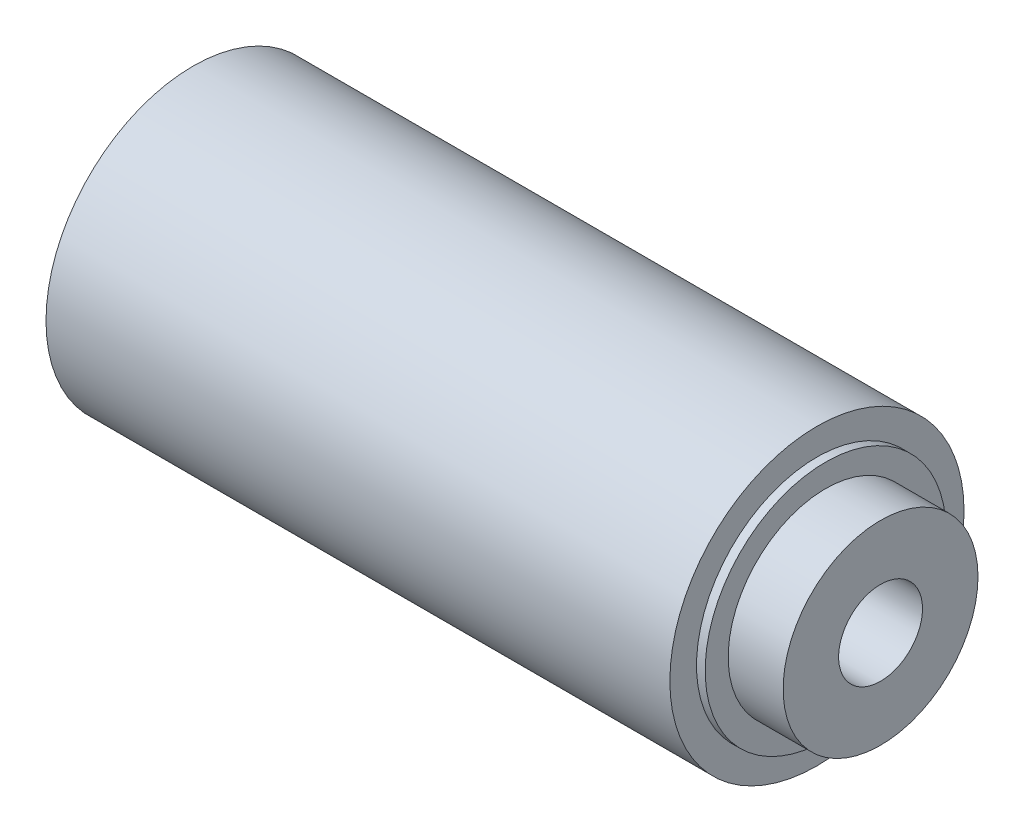
ISO-10303-21;
HEADER;
FILE_DESCRIPTION(('STEP AP214'),'2;1');
FILE_NAME('part.step','',(''),(''),'','','');
FILE_SCHEMA(('AUTOMOTIVE_DESIGN { 1 0 10303 214 1 1 1 1 }'));
ENDSEC;
DATA;
#1=APPLICATION_CONTEXT('core data for automotive mechanical design processes');
#2=APPLICATION_PROTOCOL_DEFINITION('international standard','automotive_design',2000,#1);
#3=PRODUCT_CONTEXT('',#1,'mechanical');
#4=PRODUCT('Part','Part','',(#3));
#5=PRODUCT_RELATED_PRODUCT_CATEGORY('part','',(#4));
#6=PRODUCT_DEFINITION_FORMATION('','',#4);
#7=PRODUCT_DEFINITION_CONTEXT('part definition',#1,'design');
#8=PRODUCT_DEFINITION('design','',#6,#7);
#9=PRODUCT_DEFINITION_SHAPE('','',#8);
#10=(LENGTH_UNIT() NAMED_UNIT(*) SI_UNIT(.MILLI.,.METRE.));
#11=(NAMED_UNIT(*) PLANE_ANGLE_UNIT() SI_UNIT($,.RADIAN.));
#12=(NAMED_UNIT(*) SI_UNIT($,.STERADIAN.) SOLID_ANGLE_UNIT());
#13=UNCERTAINTY_MEASURE_WITH_UNIT(LENGTH_MEASURE(1.E-05),#10,'distance_accuracy_value','');
#14=(GEOMETRIC_REPRESENTATION_CONTEXT(3) GLOBAL_UNCERTAINTY_ASSIGNED_CONTEXT((#13)) GLOBAL_UNIT_ASSIGNED_CONTEXT((#10,
#11,#12)) REPRESENTATION_CONTEXT('',''));
#15=CARTESIAN_POINT('',(0.,0.,0.));
#16=DIRECTION('',(0.,0.,1.));
#17=DIRECTION('',(1.,0.,0.));
#18=AXIS2_PLACEMENT_3D('',#15,#16,#17);
#19=CARTESIAN_POINT('',(230.5,0.,0.));
#20=DIRECTION('',(1.,0.,0.));
#21=DIRECTION('',(0.,0.,-1.));
#22=AXIS2_PLACEMENT_3D('',#19,#20,#21);
#23=CYLINDRICAL_SURFACE('',#22,44.5);
#24=CARTESIAN_POINT('',(230.5,0.,0.));
#25=DIRECTION('',(1.,0.,0.));
#26=DIRECTION('',(0.,0.,-1.));
#27=AXIS2_PLACEMENT_3D('',#24,#25,#26);
#28=CIRCLE('',#27,44.5);
#29=CARTESIAN_POINT('',(230.5,0.,-44.5));
#30=VERTEX_POINT('',#29);
#31=EDGE_CURVE('E403',#30,#30,#28,.T.);
#32=ORIENTED_EDGE('',*,*,#31,.T.);
#33=EDGE_LOOP('',(#32));
#34=FACE_BOUND('',#33,.T.);
#35=CARTESIAN_POINT('',(233.7,0.,0.));
#36=DIRECTION('',(1.,0.,0.));
#37=DIRECTION('',(0.,0.,-1.));
#38=AXIS2_PLACEMENT_3D('',#35,#36,#37);
#39=CIRCLE('',#38,44.5);
#40=CARTESIAN_POINT('',(233.7,0.,-44.5));
#41=VERTEX_POINT('',#40);
#42=EDGE_CURVE('E399',#41,#41,#39,.T.);
#43=ORIENTED_EDGE('',*,*,#42,.F.);
#44=EDGE_LOOP('',(#43));
#45=FACE_BOUND('',#44,.T.);
#46=ADVANCED_FACE('F38',(#34,#45),#23,.T.);
#47=CARTESIAN_POINT('',(230.5,0.,0.));
#48=DIRECTION('',(1.,0.,0.));
#49=DIRECTION('',(0.,0.,-1.));
#50=AXIS2_PLACEMENT_3D('',#47,#48,#49);
#51=PLANE('',#50);
#52=ORIENTED_EDGE('',*,*,#31,.F.);
#53=EDGE_LOOP('',(#52));
#54=FACE_BOUND('',#53,.T.);
#55=CARTESIAN_POINT('',(230.5,0.,0.));
#56=DIRECTION('',(1.,0.,0.));
#57=DIRECTION('',(0.,0.,-1.));
#58=AXIS2_PLACEMENT_3D('',#55,#56,#57);
#59=CIRCLE('',#58,54.345);
#60=CARTESIAN_POINT('',(230.5,0.,-54.345));
#61=VERTEX_POINT('',#60);
#62=EDGE_CURVE('E192',#61,#61,#59,.T.);
#63=ORIENTED_EDGE('',*,*,#62,.T.);
#64=EDGE_LOOP('',(#63));
#65=FACE_BOUND('',#64,.T.);
#66=ADVANCED_FACE('F232',(#54,#65),#51,.T.);
#67=CARTESIAN_POINT('',(100.,0.,0.));
#68=DIRECTION('',(1.,0.,0.));
#69=DIRECTION('',(0.,0.,-1.));
#70=AXIS2_PLACEMENT_3D('',#67,#68,#69);
#71=PLANE('',#70);
#72=CARTESIAN_POINT('',(100.,-28.194,28.1939999999984));
#73=DIRECTION('',(1.,0.,0.));
#74=DIRECTION('',(0.,0.,-1.));
#75=AXIS2_PLACEMENT_3D('',#72,#73,#74);
#76=CIRCLE('',#75,7.50000000000083);
#77=CARTESIAN_POINT('',(100.,-28.194,20.6939999999976));
#78=VERTEX_POINT('',#77);
#79=CARTESIAN_POINT('',(100.,-20.6939999999992,28.194));
#80=VERTEX_POINT('',#79);
#81=EDGE_CURVE('E157',#78,#80,#76,.T.);
#82=ORIENTED_EDGE('',*,*,#81,.T.);
#83=DIRECTION('',(0.,-1.,0.));
#84=VECTOR('',#83,1.);
#85=CARTESIAN_POINT('',(100.,0.,28.194));
#86=LINE('',#85,#84);
#87=CARTESIAN_POINT('',(100.,20.694,28.194));
#88=VERTEX_POINT('',#87);
#89=EDGE_CURVE('E62',#88,#80,#86,.T.);
#90=ORIENTED_EDGE('',*,*,#89,.F.);
#91=CARTESIAN_POINT('',(100.,28.194,28.194));
#92=DIRECTION('',(1.,0.,0.));
#93=DIRECTION('',(0.,0.,-1.));
#94=AXIS2_PLACEMENT_3D('',#91,#92,#93);
#95=CIRCLE('',#94,7.5);
#96=CARTESIAN_POINT('',(100.,28.194,20.694));
#97=VERTEX_POINT('',#96);
#98=EDGE_CURVE('E114',#88,#97,#95,.T.);
#99=ORIENTED_EDGE('',*,*,#98,.T.);
#100=DIRECTION('',(0.,0.,-1.));
#101=VECTOR('',#100,1.);
#102=CARTESIAN_POINT('',(100.,28.194,0.));
#103=LINE('',#102,#101);
#104=CARTESIAN_POINT('',(100.,28.194,-20.6939999999984));
#105=VERTEX_POINT('',#104);
#106=EDGE_CURVE('E123',#97,#105,#103,.T.);
#107=ORIENTED_EDGE('',*,*,#106,.T.);
#108=CARTESIAN_POINT('',(100.,28.1940000000016,-28.194));
#109=DIRECTION('',(1.,0.,0.));
#110=DIRECTION('',(0.,0.,-1.));
#111=AXIS2_PLACEMENT_3D('',#108,#109,#110);
#112=CIRCLE('',#111,7.50000000000164);
#113=CARTESIAN_POINT('',(100.,20.694,-28.194));
#114=VERTEX_POINT('',#113);
#115=EDGE_CURVE('E128',#105,#114,#112,.T.);
#116=ORIENTED_EDGE('',*,*,#115,.T.);
#117=DIRECTION('',(0.,-1.,0.));
#118=VECTOR('',#117,1.);
#119=CARTESIAN_POINT('',(100.,0.,-28.194));
#120=LINE('',#119,#118);
#121=CARTESIAN_POINT('',(100.,-20.6939999999962,-28.194));
#122=VERTEX_POINT('',#121);
#123=EDGE_CURVE('E202',#114,#122,#120,.T.);
#124=ORIENTED_EDGE('',*,*,#123,.T.);
#125=CARTESIAN_POINT('',(100.,-28.1939999999984,-28.1940000000016));
#126=DIRECTION('',(1.,0.,0.));
#127=DIRECTION('',(0.,0.,-1.));
#128=AXIS2_PLACEMENT_3D('',#125,#126,#127);
#129=CIRCLE('',#128,7.50000000000223);
#130=CARTESIAN_POINT('',(100.,-28.194,-20.6939999999994));
#131=VERTEX_POINT('',#130);
#132=EDGE_CURVE('E199',#122,#131,#129,.T.);
#133=ORIENTED_EDGE('',*,*,#132,.T.);
#134=DIRECTION('',(0.,0.,-1.));
#135=VECTOR('',#134,1.);
#136=CARTESIAN_POINT('',(100.,-28.194,0.));
#137=LINE('',#136,#135);
#138=EDGE_CURVE('E197',#78,#131,#137,.T.);
#139=ORIENTED_EDGE('',*,*,#138,.F.);
#140=EDGE_LOOP('',(#82,#90,#99,#107,#116,#124,#133,#139));
#141=FACE_BOUND('',#140,.T.);
#142=ADVANCED_FACE('F131',(#141),#71,.F.);
#143=CARTESIAN_POINT('',(100.,28.194,28.194));
#144=DIRECTION('',(-1.,0.,0.));
#145=DIRECTION('',(0.,0.,1.));
#146=AXIS2_PLACEMENT_3D('',#143,#144,#145);
#147=CYLINDRICAL_SURFACE('',#146,7.5);
#148=CARTESIAN_POINT('',(0.,28.194,28.194));
#149=DIRECTION('',(1.,0.,0.));
#150=DIRECTION('',(0.,0.,-1.));
#151=AXIS2_PLACEMENT_3D('',#148,#149,#150);
#152=CIRCLE('',#151,7.5);
#153=CARTESIAN_POINT('',(0.,20.694,28.194));
#154=VERTEX_POINT('',#153);
#155=CARTESIAN_POINT('',(0.,28.194,20.694));
#156=VERTEX_POINT('',#155);
#157=EDGE_CURVE('E116',#154,#156,#152,.T.);
#158=ORIENTED_EDGE('',*,*,#157,.T.);
#159=DIRECTION('',(-1.,0.,0.));
#160=VECTOR('',#159,1.);
#161=CARTESIAN_POINT('',(100.,28.194,20.694));
#162=LINE('',#161,#160);
#163=EDGE_CURVE('E110',#97,#156,#162,.T.);
#164=ORIENTED_EDGE('',*,*,#163,.F.);
#165=ORIENTED_EDGE('',*,*,#98,.F.);
#166=DIRECTION('',(-1.,0.,0.));
#167=VECTOR('',#166,1.);
#168=CARTESIAN_POINT('',(100.,20.694,28.194));
#169=LINE('',#168,#167);
#170=EDGE_CURVE('E89',#88,#154,#169,.T.);
#171=ORIENTED_EDGE('',*,*,#170,.T.);
#172=EDGE_LOOP('',(#158,#164,#165,#171));
#173=FACE_BOUND('',#172,.T.);
#174=ADVANCED_FACE('F112',(#173),#147,.T.);
#175=CARTESIAN_POINT('',(100.,28.194,0.));
#176=DIRECTION('',(0.,1.,0.));
#177=DIRECTION('',(0.,0.,1.));
#178=AXIS2_PLACEMENT_3D('',#175,#176,#177);
#179=PLANE('',#178);
#180=DIRECTION('',(0.,0.,-1.));
#181=VECTOR('',#180,1.);
#182=CARTESIAN_POINT('',(0.,28.194,0.));
#183=LINE('',#182,#181);
#184=CARTESIAN_POINT('',(0.,28.194,-20.6939999999984));
#185=VERTEX_POINT('',#184);
#186=EDGE_CURVE('E151',#156,#185,#183,.T.);
#187=ORIENTED_EDGE('',*,*,#186,.T.);
#188=DIRECTION('',(-1.,0.,0.));
#189=VECTOR('',#188,1.);
#190=CARTESIAN_POINT('',(100.,28.194,-20.6939999999984));
#191=LINE('',#190,#189);
#192=EDGE_CURVE('E120',#105,#185,#191,.T.);
#193=ORIENTED_EDGE('',*,*,#192,.F.);
#194=ORIENTED_EDGE('',*,*,#106,.F.);
#195=ORIENTED_EDGE('',*,*,#163,.T.);
#196=EDGE_LOOP('',(#187,#193,#194,#195));
#197=FACE_BOUND('',#196,.T.);
#198=ADVANCED_FACE('F124',(#197),#179,.F.);
#199=CARTESIAN_POINT('',(100.,28.1940000000016,-28.194));
#200=DIRECTION('',(-1.,0.,0.));
#201=DIRECTION('',(0.,0.,1.));
#202=AXIS2_PLACEMENT_3D('',#199,#200,#201);
#203=CYLINDRICAL_SURFACE('',#202,7.50000000000164);
#204=CARTESIAN_POINT('',(0.,28.1940000000016,-28.194));
#205=DIRECTION('',(1.,0.,0.));
#206=DIRECTION('',(0.,0.,-1.));
#207=AXIS2_PLACEMENT_3D('',#204,#205,#206);
#208=CIRCLE('',#207,7.50000000000164);
#209=CARTESIAN_POINT('',(0.,20.694,-28.194));
#210=VERTEX_POINT('',#209);
#211=EDGE_CURVE('E148',#185,#210,#208,.T.);
#212=ORIENTED_EDGE('',*,*,#211,.T.);
#213=DIRECTION('',(-1.,0.,0.));
#214=VECTOR('',#213,1.);
#215=CARTESIAN_POINT('',(100.,20.694,-28.194));
#216=LINE('',#215,#214);
#217=EDGE_CURVE('E161',#114,#210,#216,.T.);
#218=ORIENTED_EDGE('',*,*,#217,.F.);
#219=ORIENTED_EDGE('',*,*,#115,.F.);
#220=ORIENTED_EDGE('',*,*,#192,.T.);
#221=EDGE_LOOP('',(#212,#218,#219,#220));
#222=FACE_BOUND('',#221,.T.);
#223=ADVANCED_FACE('F206',(#222),#203,.T.);
#224=CARTESIAN_POINT('',(100.,0.,-28.194));
#225=DIRECTION('',(0.,0.,-1.));
#226=DIRECTION('',(0.,1.,0.));
#227=AXIS2_PLACEMENT_3D('',#224,#225,#226);
#228=PLANE('',#227);
#229=DIRECTION('',(0.,-1.,0.));
#230=VECTOR('',#229,1.);
#231=CARTESIAN_POINT('',(0.,0.,-28.194));
#232=LINE('',#231,#230);
#233=CARTESIAN_POINT('',(0.,-20.6939999999962,-28.194));
#234=VERTEX_POINT('',#233);
#235=EDGE_CURVE('E145',#210,#234,#232,.T.);
#236=ORIENTED_EDGE('',*,*,#235,.T.);
#237=DIRECTION('',(-1.,0.,0.));
#238=VECTOR('',#237,1.);
#239=CARTESIAN_POINT('',(100.,-20.6939999999962,-28.194));
#240=LINE('',#239,#238);
#241=EDGE_CURVE('E163',#122,#234,#240,.T.);
#242=ORIENTED_EDGE('',*,*,#241,.F.);
#243=ORIENTED_EDGE('',*,*,#123,.F.);
#244=ORIENTED_EDGE('',*,*,#217,.T.);
#245=EDGE_LOOP('',(#236,#242,#243,#244));
#246=FACE_BOUND('',#245,.T.);
#247=ADVANCED_FACE('F210',(#246),#228,.F.);
#248=CARTESIAN_POINT('',(100.,-28.1939999999984,-28.1940000000016));
#249=DIRECTION('',(-1.,0.,0.));
#250=DIRECTION('',(0.,0.,1.));
#251=AXIS2_PLACEMENT_3D('',#248,#249,#250);
#252=CYLINDRICAL_SURFACE('',#251,7.50000000000223);
#253=CARTESIAN_POINT('',(0.,-28.1939999999984,-28.1940000000016));
#254=DIRECTION('',(1.,0.,0.));
#255=DIRECTION('',(0.,0.,-1.));
#256=AXIS2_PLACEMENT_3D('',#253,#254,#255);
#257=CIRCLE('',#256,7.50000000000223);
#258=CARTESIAN_POINT('',(0.,-28.194,-20.6939999999994));
#259=VERTEX_POINT('',#258);
#260=EDGE_CURVE('E142',#234,#259,#257,.T.);
#261=ORIENTED_EDGE('',*,*,#260,.T.);
#262=DIRECTION('',(-1.,0.,0.));
#263=VECTOR('',#262,1.);
#264=CARTESIAN_POINT('',(100.,-28.194,-20.6939999999994));
#265=LINE('',#264,#263);
#266=EDGE_CURVE('E165',#131,#259,#265,.T.);
#267=ORIENTED_EDGE('',*,*,#266,.F.);
#268=ORIENTED_EDGE('',*,*,#132,.F.);
#269=ORIENTED_EDGE('',*,*,#241,.T.);
#270=EDGE_LOOP('',(#261,#267,#268,#269));
#271=FACE_BOUND('',#270,.T.);
#272=ADVANCED_FACE('F215',(#271),#252,.T.);
#273=CARTESIAN_POINT('',(100.,-28.194,0.));
#274=DIRECTION('',(0.,1.,0.));
#275=DIRECTION('',(0.,0.,1.));
#276=AXIS2_PLACEMENT_3D('',#273,#274,#275);
#277=PLANE('',#276);
#278=DIRECTION('',(0.,0.,-1.));
#279=VECTOR('',#278,1.);
#280=CARTESIAN_POINT('',(0.,-28.194,0.));
#281=LINE('',#280,#279);
#282=CARTESIAN_POINT('',(0.,-28.194,20.6939999999976));
#283=VERTEX_POINT('',#282);
#284=EDGE_CURVE('E138',#283,#259,#281,.T.);
#285=ORIENTED_EDGE('',*,*,#284,.F.);
#286=DIRECTION('',(-1.,0.,0.));
#287=VECTOR('',#286,1.);
#288=CARTESIAN_POINT('',(100.,-28.194,20.6939999999976));
#289=LINE('',#288,#287);
#290=EDGE_CURVE('E97',#78,#283,#289,.T.);
#291=ORIENTED_EDGE('',*,*,#290,.F.);
#292=ORIENTED_EDGE('',*,*,#138,.T.);
#293=ORIENTED_EDGE('',*,*,#266,.T.);
#294=EDGE_LOOP('',(#285,#291,#292,#293));
#295=FACE_BOUND('',#294,.T.);
#296=ADVANCED_FACE('F222',(#295),#277,.T.);
#297=CARTESIAN_POINT('',(100.,-28.194,28.1939999999984));
#298=DIRECTION('',(-1.,0.,0.));
#299=DIRECTION('',(0.,0.,1.));
#300=AXIS2_PLACEMENT_3D('',#297,#298,#299);
#301=CYLINDRICAL_SURFACE('',#300,7.50000000000083);
#302=CARTESIAN_POINT('',(0.,-28.194,28.1939999999984));
#303=DIRECTION('',(1.,0.,0.));
#304=DIRECTION('',(0.,0.,-1.));
#305=AXIS2_PLACEMENT_3D('',#302,#303,#304);
#306=CIRCLE('',#305,7.50000000000083);
#307=CARTESIAN_POINT('',(0.,-20.6939999999992,28.194));
#308=VERTEX_POINT('',#307);
#309=EDGE_CURVE('E54',#283,#308,#306,.T.);
#310=ORIENTED_EDGE('',*,*,#309,.T.);
#311=DIRECTION('',(-1.,0.,0.));
#312=VECTOR('',#311,1.);
#313=CARTESIAN_POINT('',(100.,-20.6939999999992,28.194));
#314=LINE('',#313,#312);
#315=EDGE_CURVE('E133',#80,#308,#314,.T.);
#316=ORIENTED_EDGE('',*,*,#315,.F.);
#317=ORIENTED_EDGE('',*,*,#81,.F.);
#318=ORIENTED_EDGE('',*,*,#290,.T.);
#319=EDGE_LOOP('',(#310,#316,#317,#318));
#320=FACE_BOUND('',#319,.T.);
#321=ADVANCED_FACE('F217',(#320),#301,.T.);
#322=CARTESIAN_POINT('',(100.,0.,28.194));
#323=DIRECTION('',(0.,0.,-1.));
#324=DIRECTION('',(0.,1.,0.));
#325=AXIS2_PLACEMENT_3D('',#322,#323,#324);
#326=PLANE('',#325);
#327=DIRECTION('',(0.,-1.,0.));
#328=VECTOR('',#327,1.);
#329=CARTESIAN_POINT('',(0.,0.,28.194));
#330=LINE('',#329,#328);
#331=EDGE_CURVE('E154',#154,#308,#330,.T.);
#332=ORIENTED_EDGE('',*,*,#331,.F.);
#333=ORIENTED_EDGE('',*,*,#170,.F.);
#334=ORIENTED_EDGE('',*,*,#89,.T.);
#335=ORIENTED_EDGE('',*,*,#315,.T.);
#336=EDGE_LOOP('',(#332,#333,#334,#335));
#337=FACE_BOUND('',#336,.T.);
#338=ADVANCED_FACE('F218',(#337),#326,.T.);
#339=CARTESIAN_POINT('',(0.,0.,0.));
#340=DIRECTION('',(1.,0.,0.));
#341=DIRECTION('',(0.,0.,-1.));
#342=AXIS2_PLACEMENT_3D('',#339,#340,#341);
#343=PLANE('',#342);
#344=ORIENTED_EDGE('',*,*,#331,.T.);
#345=ORIENTED_EDGE('',*,*,#309,.F.);
#346=ORIENTED_EDGE('',*,*,#284,.T.);
#347=ORIENTED_EDGE('',*,*,#260,.F.);
#348=ORIENTED_EDGE('',*,*,#235,.F.);
#349=ORIENTED_EDGE('',*,*,#211,.F.);
#350=ORIENTED_EDGE('',*,*,#186,.F.);
#351=ORIENTED_EDGE('',*,*,#157,.F.);
#352=EDGE_LOOP('',(#344,#345,#346,#347,#348,#349,#350,#351));
#353=FACE_BOUND('',#352,.T.);
#354=CARTESIAN_POINT('',(0.,0.,0.));
#355=DIRECTION('',(1.,0.,0.));
#356=DIRECTION('',(0.,0.,-1.));
#357=AXIS2_PLACEMENT_3D('',#354,#355,#356);
#358=CIRCLE('',#357,54.345);
#359=CARTESIAN_POINT('',(0.,0.,-54.345));
#360=VERTEX_POINT('',#359);
#361=EDGE_CURVE('E168',#360,#360,#358,.T.);
#362=ORIENTED_EDGE('',*,*,#361,.F.);
#363=EDGE_LOOP('',(#362));
#364=FACE_BOUND('',#363,.T.);
#365=ADVANCED_FACE('F220',(#353,#364),#343,.F.);
#366=CARTESIAN_POINT('',(254.,0.,0.));
#367=DIRECTION('',(-1.,0.,0.));
#368=DIRECTION('',(0.,0.,1.));
#369=AXIS2_PLACEMENT_3D('',#366,#367,#368);
#370=CYLINDRICAL_SURFACE('',#369,54.345);
#371=ORIENTED_EDGE('',*,*,#361,.T.);
#372=EDGE_LOOP('',(#371));
#373=FACE_BOUND('',#372,.T.);
#374=ORIENTED_EDGE('',*,*,#62,.F.);
#375=EDGE_LOOP('',(#374));
#376=FACE_BOUND('',#375,.T.);
#377=ADVANCED_FACE('F286',(#373,#376),#370,.T.);
#378=CARTESIAN_POINT('',(233.7,0.,0.));
#379=DIRECTION('',(1.,0.,0.));
#380=DIRECTION('',(0.,0.,-1.));
#381=AXIS2_PLACEMENT_3D('',#378,#379,#380);
#382=CYLINDRICAL_SURFACE('',#381,36.);
#383=CARTESIAN_POINT('',(233.7,0.,0.));
#384=DIRECTION('',(1.,0.,0.));
#385=DIRECTION('',(0.,0.,-1.));
#386=AXIS2_PLACEMENT_3D('',#383,#384,#385);
#387=CIRCLE('',#386,36.);
#388=CARTESIAN_POINT('',(233.7,0.,-36.));
#389=VERTEX_POINT('',#388);
#390=EDGE_CURVE('E396',#389,#389,#387,.T.);
#391=ORIENTED_EDGE('',*,*,#390,.T.);
#392=EDGE_LOOP('',(#391));
#393=FACE_BOUND('',#392,.T.);
#394=CARTESIAN_POINT('',(254.,0.,0.));
#395=DIRECTION('',(1.,0.,0.));
#396=DIRECTION('',(0.,0.,-1.));
#397=AXIS2_PLACEMENT_3D('',#394,#395,#396);
#398=CIRCLE('',#397,36.);
#399=CARTESIAN_POINT('',(254.,0.,-36.));
#400=VERTEX_POINT('',#399);
#401=EDGE_CURVE('E394',#400,#400,#398,.T.);
#402=ORIENTED_EDGE('',*,*,#401,.F.);
#403=EDGE_LOOP('',(#402));
#404=FACE_BOUND('',#403,.T.);
#405=ADVANCED_FACE('F297',(#393,#404),#382,.T.);
#406=CARTESIAN_POINT('',(233.7,0.,0.));
#407=DIRECTION('',(1.,0.,0.));
#408=DIRECTION('',(0.,0.,-1.));
#409=AXIS2_PLACEMENT_3D('',#406,#407,#408);
#410=PLANE('',#409);
#411=ORIENTED_EDGE('',*,*,#390,.F.);
#412=EDGE_LOOP('',(#411));
#413=FACE_BOUND('',#412,.T.);
#414=ORIENTED_EDGE('',*,*,#42,.T.);
#415=EDGE_LOOP('',(#414));
#416=FACE_BOUND('',#415,.T.);
#417=ADVANCED_FACE('F247',(#413,#416),#410,.T.);
#418=CARTESIAN_POINT('',(115.,0.,0.));
#419=DIRECTION('',(1.,0.,0.));
#420=DIRECTION('',(0.,0.,-1.));
#421=AXIS2_PLACEMENT_3D('',#418,#419,#420);
#422=PLANE('',#421);
#423=CARTESIAN_POINT('',(115.,0.,0.));
#424=DIRECTION('',(1.,0.,0.));
#425=DIRECTION('',(0.,0.,-1.));
#426=AXIS2_PLACEMENT_3D('',#423,#424,#425);
#427=CIRCLE('',#426,7.);
#428=CARTESIAN_POINT('',(115.,0.,-7.));
#429=VERTEX_POINT('',#428);
#430=EDGE_CURVE('E139',#429,#429,#427,.T.);
#431=ORIENTED_EDGE('',*,*,#430,.T.);
#432=EDGE_LOOP('',(#431));
#433=FACE_BOUND('',#432,.T.);
#434=ADVANCED_FACE('F184',(#433),#422,.T.);
#435=CARTESIAN_POINT('',(115.,0.,0.));
#436=DIRECTION('',(1.,0.,0.));
#437=DIRECTION('',(0.,0.,-1.));
#438=AXIS2_PLACEMENT_3D('',#435,#436,#437);
#439=CYLINDRICAL_SURFACE('',#438,7.);
#440=CARTESIAN_POINT('',(190.5,0.,0.));
#441=DIRECTION('',(1.,0.,0.));
#442=DIRECTION('',(0.,0.,-1.));
#443=AXIS2_PLACEMENT_3D('',#440,#441,#442);
#444=CIRCLE('',#443,7.);
#445=CARTESIAN_POINT('',(190.5,0.,-7.));
#446=VERTEX_POINT('',#445);
#447=EDGE_CURVE('E11',#446,#446,#444,.T.);
#448=ORIENTED_EDGE('',*,*,#447,.T.);
#449=EDGE_LOOP('',(#448));
#450=FACE_BOUND('',#449,.T.);
#451=ORIENTED_EDGE('',*,*,#430,.F.);
#452=EDGE_LOOP('',(#451));
#453=FACE_BOUND('',#452,.T.);
#454=ADVANCED_FACE('F181',(#450,#453),#439,.F.);
#455=CARTESIAN_POINT('',(189.,0.,0.));
#456=DIRECTION('',(1.,0.,0.));
#457=DIRECTION('',(0.,0.,-1.));
#458=AXIS2_PLACEMENT_3D('',#455,#456,#457);
#459=CYLINDRICAL_SURFACE('',#458,15.5);
#460=CARTESIAN_POINT('',(199.,0.,0.));
#461=DIRECTION('',(1.,0.,0.));
#462=DIRECTION('',(0.,0.,-1.));
#463=AXIS2_PLACEMENT_3D('',#460,#461,#462);
#464=CIRCLE('',#463,15.5);
#465=CARTESIAN_POINT('',(199.,0.,-15.5));
#466=VERTEX_POINT('',#465);
#467=EDGE_CURVE('E47',#466,#466,#464,.F.);
#468=ORIENTED_EDGE('',*,*,#467,.T.);
#469=EDGE_LOOP('',(#468));
#470=FACE_BOUND('',#469,.T.);
#471=CARTESIAN_POINT('',(254.,0.,0.));
#472=DIRECTION('',(1.,0.,0.));
#473=DIRECTION('',(0.,0.,-1.));
#474=AXIS2_PLACEMENT_3D('',#471,#472,#473);
#475=CIRCLE('',#474,15.5);
#476=CARTESIAN_POINT('',(254.,0.,-15.5));
#477=VERTEX_POINT('',#476);
#478=EDGE_CURVE('E189',#477,#477,#475,.T.);
#479=ORIENTED_EDGE('',*,*,#478,.T.);
#480=EDGE_LOOP('',(#479));
#481=FACE_BOUND('',#480,.T.);
#482=ADVANCED_FACE('F173',(#470,#481),#459,.F.);
#483=CARTESIAN_POINT('',(254.,0.,0.));
#484=DIRECTION('',(1.,0.,0.));
#485=DIRECTION('',(0.,0.,-1.));
#486=AXIS2_PLACEMENT_3D('',#483,#484,#485);
#487=PLANE('',#486);
#488=ORIENTED_EDGE('',*,*,#478,.F.);
#489=EDGE_LOOP('',(#488));
#490=FACE_BOUND('',#489,.T.);
#491=ORIENTED_EDGE('',*,*,#401,.T.);
#492=EDGE_LOOP('',(#491));
#493=FACE_BOUND('',#492,.T.);
#494=ADVANCED_FACE('F178',(#490,#493),#487,.T.);
#495=CARTESIAN_POINT('',(189.,0.,0.));
#496=DIRECTION('',(1.,0.,0.));
#497=DIRECTION('',(0.,0.,-1.));
#498=AXIS2_PLACEMENT_3D('',#495,#496,#497);
#499=CONICAL_SURFACE('',#498,5.49999999999982,0.785398163397454);
#500=ORIENTED_EDGE('',*,*,#467,.F.);
#501=EDGE_LOOP('',(#500));
#502=FACE_BOUND('',#501,.T.);
#503=ORIENTED_EDGE('',*,*,#447,.F.);
#504=EDGE_LOOP('',(#503));
#505=FACE_BOUND('',#504,.T.);
#506=ADVANCED_FACE('F41',(#502,#505),#499,.F.);
#507=CLOSED_SHELL('',(#46,#66,#142,#174,#198,#223,#247,#272,#296,#321,#338,#365,#377,#405,#417,
#434,#454,#482,#494,#506));
#508=MANIFOLD_SOLID_BREP('B2',#507);
#509=ADVANCED_BREP_SHAPE_REPRESENTATION('',(#18,#508),#14);
#510=SHAPE_DEFINITION_REPRESENTATION(#9,#509);
ENDSEC;
END-ISO-10303-21;
